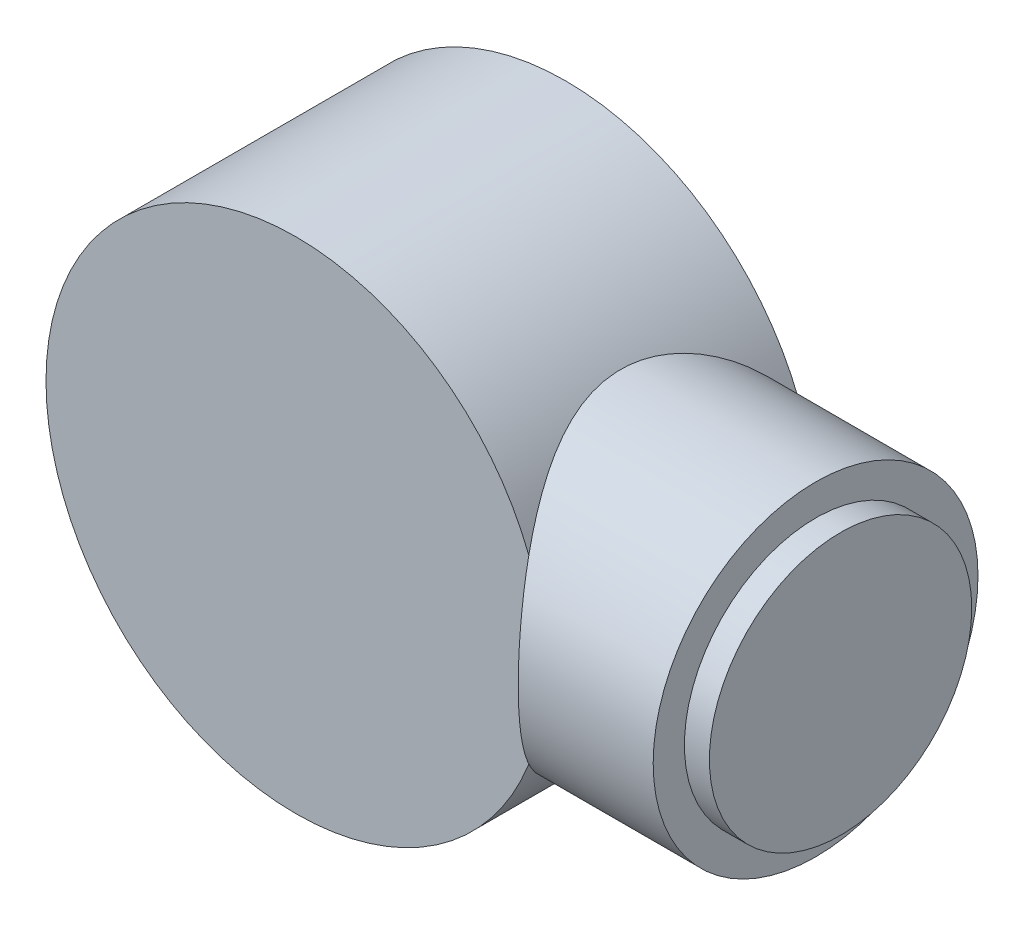
ISO-10303-21;
HEADER;
FILE_DESCRIPTION(('STEP AP214'),'2;1');
FILE_NAME('part.step','',(''),(''),'','','');
FILE_SCHEMA(('AUTOMOTIVE_DESIGN { 1 0 10303 214 1 1 1 1 }'));
ENDSEC;
DATA;
#1=APPLICATION_CONTEXT('core data for automotive mechanical design processes');
#2=APPLICATION_PROTOCOL_DEFINITION('international standard','automotive_design',2000,#1);
#3=PRODUCT_CONTEXT('',#1,'mechanical');
#4=PRODUCT('Part','Part','',(#3));
#5=PRODUCT_RELATED_PRODUCT_CATEGORY('part','',(#4));
#6=PRODUCT_DEFINITION_FORMATION('','',#4);
#7=PRODUCT_DEFINITION_CONTEXT('part definition',#1,'design');
#8=PRODUCT_DEFINITION('design','',#6,#7);
#9=PRODUCT_DEFINITION_SHAPE('','',#8);
#10=(LENGTH_UNIT() NAMED_UNIT(*) SI_UNIT(.MILLI.,.METRE.));
#11=(NAMED_UNIT(*) PLANE_ANGLE_UNIT() SI_UNIT($,.RADIAN.));
#12=(NAMED_UNIT(*) SI_UNIT($,.STERADIAN.) SOLID_ANGLE_UNIT());
#13=UNCERTAINTY_MEASURE_WITH_UNIT(LENGTH_MEASURE(1.E-05),#10,'distance_accuracy_value','');
#14=(GEOMETRIC_REPRESENTATION_CONTEXT(3) GLOBAL_UNCERTAINTY_ASSIGNED_CONTEXT((#13)) GLOBAL_UNIT_ASSIGNED_CONTEXT((#10,
#11,#12)) REPRESENTATION_CONTEXT('',''));
#15=CARTESIAN_POINT('',(0.,0.,0.));
#16=DIRECTION('',(0.,0.,1.));
#17=DIRECTION('',(1.,0.,0.));
#18=AXIS2_PLACEMENT_3D('',#15,#16,#17);
#19=CARTESIAN_POINT('',(77.,0.,0.));
#20=DIRECTION('',(1.,0.,0.));
#21=DIRECTION('',(0.,0.,-1.));
#22=AXIS2_PLACEMENT_3D('',#19,#20,#21);
#23=PLANE('',#22);
#24=CARTESIAN_POINT('',(77.,0.,27.));
#25=DIRECTION('',(1.,0.,0.));
#26=DIRECTION('',(0.,0.,-1.));
#27=AXIS2_PLACEMENT_3D('',#24,#25,#26);
#28=CIRCLE('',#27,26.25);
#29=CARTESIAN_POINT('',(77.,0.,0.750000000000001));
#30=VERTEX_POINT('',#29);
#31=EDGE_CURVE('E11',#30,#30,#28,.T.);
#32=ORIENTED_EDGE('',*,*,#31,.F.);
#33=EDGE_LOOP('',(#32));
#34=FACE_BOUND('',#33,.T.);
#35=CARTESIAN_POINT('',(77.,0.,27.));
#36=DIRECTION('',(1.,0.,0.));
#37=DIRECTION('',(0.,0.,-1.));
#38=AXIS2_PLACEMENT_3D('',#35,#36,#37);
#39=CIRCLE('',#38,32.5);
#40=CARTESIAN_POINT('',(77.,0.,-5.5));
#41=VERTEX_POINT('',#40);
#42=EDGE_CURVE('E63',#41,#41,#39,.T.);
#43=ORIENTED_EDGE('',*,*,#42,.T.);
#44=EDGE_LOOP('',(#43));
#45=FACE_BOUND('',#44,.T.);
#46=ADVANCED_FACE('F47',(#34,#45),#23,.T.);
#47=CARTESIAN_POINT('',(-50.001,0.,27.));
#48=DIRECTION('',(1.,0.,0.));
#49=DIRECTION('',(0.,0.,-1.));
#50=AXIS2_PLACEMENT_3D('',#47,#48,#49);
#51=CYLINDRICAL_SURFACE('',#50,32.5);
#52=ORIENTED_EDGE('',*,*,#42,.F.);
#53=EDGE_LOOP('',(#52));
#54=FACE_BOUND('',#53,.T.);
#55=CARTESIAN_POINT('',(50.,0.,-5.5));
#56=CARTESIAN_POINT('',(49.9999950832951,0.820379898340808,-5.49999466046045));
#57=CARTESIAN_POINT('',(49.9797625626082,1.64084726886599,-5.46889183519829));
#58=CARTESIAN_POINT('',(49.8993279047576,3.27517627569682,-5.34493934746414));
#59=CARTESIAN_POINT('',(49.8391202522668,4.08903698480234,-5.25208116466715));
#60=CARTESIAN_POINT('',(49.6801748227282,5.70432342494345,-5.00591516436292));
#61=CARTESIAN_POINT('',(49.5814093942654,6.50573980179267,-4.85256396392356));
#62=CARTESIAN_POINT('',(49.3477186738602,8.08972592140923,-4.48756849820513));
#63=CARTESIAN_POINT('',(49.212794126871,8.87229605208658,-4.2759254338575));
#64=CARTESIAN_POINT('',(48.9105837019917,10.409890979968,-3.79820184570894));
#65=CARTESIAN_POINT('',(48.7434562311797,11.1650299429453,-3.53238743761594));
#66=CARTESIAN_POINT('',(48.3799715633452,12.6475670057983,-2.94868585443072));
#67=CARTESIAN_POINT('',(48.1836142984633,13.3749650412661,-2.63079855844675));
#68=CARTESIAN_POINT('',(47.7655753618638,14.7986574365594,-1.9460483734245));
#69=CARTESIAN_POINT('',(47.5438947789436,15.4949531318671,-1.57918758992853));
#70=CARTESIAN_POINT('',(47.0793256843562,16.853866771853,-0.799477265192811));
#71=CARTESIAN_POINT('',(46.8364361825179,17.5164831418727,-0.38662557654837));
#72=CARTESIAN_POINT('',(46.31288226742,18.8594396012604,0.518300920156271));
#73=CARTESIAN_POINT('',(46.030755539401,19.5366956160193,1.01410599191766));
#74=CARTESIAN_POINT('',(45.4522443941303,20.8472210237898,2.05320041309447));
#75=CARTESIAN_POINT('',(45.1558593389838,21.4804884457185,2.59649188786588));
#76=CARTESIAN_POINT('',(44.5542181709047,22.7021098692218,3.72858800385993));
#77=CARTESIAN_POINT('',(44.2489510586984,23.2904045982318,4.31745071869159));
#78=CARTESIAN_POINT('',(43.635955205152,24.4195865043336,5.53782423965643));
#79=CARTESIAN_POINT('',(43.3282263201168,24.9604708916954,6.16933755157977));
#80=CARTESIAN_POINT('',(42.6711530158535,26.0700560672088,7.57025191176403));
#81=CARTESIAN_POINT('',(42.3224327873107,26.6309119255251,8.34618501317327));
#82=CARTESIAN_POINT('',(41.6406131212886,27.6848953678642,9.94957044777783));
#83=CARTESIAN_POINT('',(41.3075169872343,28.1780086711108,10.7770335907289));
#84=CARTESIAN_POINT('',(40.669017868988,29.0919462219696,12.4796375672601));
#85=CARTESIAN_POINT('',(40.3635774153682,29.5128689906529,13.3547112402174));
#86=CARTESIAN_POINT('',(39.7925815815168,30.2783525612671,15.1499984864518));
#87=CARTESIAN_POINT('',(39.5270080979029,30.6229480570224,16.0701913179829));
#88=CARTESIAN_POINT('',(39.1151707569848,31.1461312138078,17.6898576211882));
#89=CARTESIAN_POINT('',(38.9562369559204,31.3442611136038,18.3798478972654));
#90=CARTESIAN_POINT('',(38.6709512544293,31.695564794545,19.7777927595638));
#91=CARTESIAN_POINT('',(38.5445940631359,31.848745876524,20.4857444080825));
#92=CARTESIAN_POINT('',(38.328980642896,32.1079075043085,21.9148379579285));
#93=CARTESIAN_POINT('',(38.2396737765112,32.213952486247,22.6359604408029));
#94=CARTESIAN_POINT('',(38.1013167187525,32.3774801531489,24.0875823449805));
#95=CARTESIAN_POINT('',(38.0522668939434,32.4349623959195,24.8180818516057));
#96=CARTESIAN_POINT('',(37.9963316864904,32.5004721086949,26.2854803451552));
#97=CARTESIAN_POINT('',(37.9895935697563,32.508326850756,27.0223927537606));
#98=CARTESIAN_POINT('',(38.0189586121582,32.4739783985208,28.4941838153935));
#99=CARTESIAN_POINT('',(38.0550619680412,32.4317749743356,29.2290624590657));
#100=CARTESIAN_POINT('',(38.168648429343,32.298017031725,30.691581698894));
#101=CARTESIAN_POINT('',(38.2461617042717,32.2064265315171,31.4192166233723));
#102=CARTESIAN_POINT('',(38.43953216099,31.9753805209268,32.8616220334858));
#103=CARTESIAN_POINT('',(38.5553901243586,31.8359240348907,33.5763922565868));
#104=CARTESIAN_POINT('',(38.8165742872301,31.5168911106297,34.9639466936341));
#105=CARTESIAN_POINT('',(38.9607173353993,31.33890276179,35.6373226704315));
#106=CARTESIAN_POINT('',(39.2765368375223,30.9421702821062,36.9655787328999));
#107=CARTESIAN_POINT('',(39.4482240312041,30.7234102485866,37.6204514863652));
#108=CARTESIAN_POINT('',(39.8145826406525,30.247135742793,38.9093625725826));
#109=CARTESIAN_POINT('',(40.0092566397756,29.9896169137431,39.5433985533529));
#110=CARTESIAN_POINT('',(40.4170288058455,29.4377556466839,40.7888514561042));
#111=CARTESIAN_POINT('',(40.6301227285746,29.1434216844657,41.4002735425394));
#112=CARTESIAN_POINT('',(41.1140079381856,28.457817543033,42.7180777586586));
#113=CARTESIAN_POINT('',(41.3878797638847,28.0588852943435,43.4193502974399));
#114=CARTESIAN_POINT('',(41.949038749162,27.2127893027469,44.7865262043896));
#115=CARTESIAN_POINT('',(42.2363271724089,26.7656210114159,45.452426228251));
#116=CARTESIAN_POINT('',(42.8182561243996,25.8244717865271,46.7481253404724));
#117=CARTESIAN_POINT('',(43.1129043018876,25.330440520131,47.3778844200849));
#118=CARTESIAN_POINT('',(43.7033294929278,24.2975913742116,48.5989955295088));
#119=CARTESIAN_POINT('',(43.9991065762731,23.7587706814012,49.1903451426055));
#120=CARTESIAN_POINT('',(44.6433757161103,22.5286511323823,50.4440586838091));
#121=CARTESIAN_POINT('',(44.9909276528173,21.8280825337455,51.0978541444607));
#122=CARTESIAN_POINT('',(45.6707389230497,20.3674410882344,52.3444130595286));
#123=CARTESIAN_POINT('',(46.0029955959866,19.6073579505351,52.9371659176914));
#124=CARTESIAN_POINT('',(46.6432717696123,18.0313075910058,54.0565210365045));
#125=CARTESIAN_POINT('',(46.9513108856265,17.2153866190105,54.5831770437384));
#126=CARTESIAN_POINT('',(47.5350545534779,15.531013891883,55.5654939457799));
#127=CARTESIAN_POINT('',(47.8107680817938,14.6625768219423,56.0211745613144));
#128=CARTESIAN_POINT('',(48.2712989219017,13.0551073362084,56.773110475653));
#129=CARTESIAN_POINT('',(48.4633033177363,12.324514168495,57.0830659962705));
#130=CARTESIAN_POINT('',(48.8176192333411,10.8362739804481,57.6505975880767));
#131=CARTESIAN_POINT('',(48.979934361987,10.0786302616407,57.9081800258954));
#132=CARTESIAN_POINT('',(49.2713253417834,8.54098217221501,58.3678991154421));
#133=CARTESIAN_POINT('',(49.4004230450817,7.76099287899599,58.5700722240386));
#134=CARTESIAN_POINT('',(49.6226053964351,6.18317573262193,58.9166205684597));
#135=CARTESIAN_POINT('',(49.7156894160999,5.38534756845951,59.0609947957731));
#136=CARTESIAN_POINT('',(49.8639036202448,3.77460108589335,59.2903482323196));
#137=CARTESIAN_POINT('',(49.9188902972156,2.9616374291221,59.3751028808245));
#138=CARTESIAN_POINT('',(49.9889806039512,1.32990448445416,59.4830706056691));
#139=CARTESIAN_POINT('',(50.0040842099017,0.511135193091196,59.506283645262));
#140=CARTESIAN_POINT('',(49.9940280170243,-1.12558702772942,59.4908120509778));
#141=CARTESIAN_POINT('',(49.9688671194818,-1.9435399343006,59.4521257280265));
#142=CARTESIAN_POINT('',(49.8789112577068,-3.57199749573233,59.3134426463783));
#143=CARTESIAN_POINT('',(49.8141175484482,-4.38250238560966,59.2134478290158));
#144=CARTESIAN_POINT('',(49.6514918470381,-5.94197489256988,58.9613719584213));
#145=CARTESIAN_POINT('',(49.555854505623,-6.6917350268788,58.8127432372991));
#146=CARTESIAN_POINT('',(49.3329577485776,-8.1744282627694,58.4644026294863));
#147=CARTESIAN_POINT('',(49.2056998557011,-8.907362172797,58.2646932026805));
#148=CARTESIAN_POINT('',(48.9220905433369,-10.3523561917551,57.8164089830273));
#149=CARTESIAN_POINT('',(48.7657373107556,-11.0644149966383,57.5678311448613));
#150=CARTESIAN_POINT('',(48.4268841832775,-12.4641703227049,57.0242943573914));
#151=CARTESIAN_POINT('',(48.2443828654948,-13.1518655155656,56.7293328839699));
#152=CARTESIAN_POINT('',(47.8429790386047,-14.5468935746808,56.0735703190451));
#153=CARTESIAN_POINT('',(47.6224282140744,-15.2522697974981,55.7096182026578));
#154=CARTESIAN_POINT('',(47.1593126222709,-16.629097865148,54.9346965691568));
#155=CARTESIAN_POINT('',(46.9167470587903,-17.3005484816245,54.5237253513626));
#156=CARTESIAN_POINT('',(46.4138194489232,-18.607742420822,53.6574027719117));
#157=CARTESIAN_POINT('',(46.1534470794155,-19.2434646350104,53.2020256005709));
#158=CARTESIAN_POINT('',(45.619526143917,-20.4770764710835,52.2496858797039));
#159=CARTESIAN_POINT('',(45.3459768617906,-21.074964032645,51.7527210688985));
#160=CARTESIAN_POINT('',(44.7471563176791,-22.3213173683831,50.6391921817521));
#161=CARTESIAN_POINT('',(44.4204496488134,-22.9632199419752,50.0160396905248));
#162=CARTESIAN_POINT('',(43.7630045869561,-24.1926746957852,48.7200933671887));
#163=CARTESIAN_POINT('',(43.4322656332202,-24.7802192169113,48.047292563529));
#164=CARTESIAN_POINT('',(42.7745161992376,-25.8990740511106,46.6541722015348));
#165=CARTESIAN_POINT('',(42.4475074152823,-26.4303596241356,45.9338319617479));
#166=CARTESIAN_POINT('',(41.8059041408205,-27.4339387672869,44.4479953540767));
#167=CARTESIAN_POINT('',(41.4913079318813,-27.906240523045,43.6825052737353));
#168=CARTESIAN_POINT('',(40.9200564815249,-28.7362441351099,42.2022955754751));
#169=CARTESIAN_POINT('',(40.6609659921665,-29.1008956870287,41.4924109597111));
#170=CARTESIAN_POINT('',(40.1664965087985,-29.779672463042,40.0408179524925));
#171=CARTESIAN_POINT('',(39.9311170218804,-30.0937987375458,39.2991102230396));
#172=CARTESIAN_POINT('',(39.4917120575915,-30.6681484086005,37.7873745813625));
#173=CARTESIAN_POINT('',(39.287640214774,-30.9284517177363,37.0173906827655));
#174=CARTESIAN_POINT('',(38.9178700773443,-31.3924770297742,35.4515519018164));
#175=CARTESIAN_POINT('',(38.7521647978538,-31.5962093331374,34.6557017587133));
#176=CARTESIAN_POINT('',(38.487621867937,-31.9176987315613,33.1645325250141));
#177=CARTESIAN_POINT('',(38.3824721686329,-32.0437830280959,32.4721239485102));
#178=CARTESIAN_POINT('',(38.2084463267924,-32.2510939378217,31.0761112799988));
#179=CARTESIAN_POINT('',(38.139566259711,-32.3323254043466,30.3725084077581));
#180=CARTESIAN_POINT('',(38.0406628594831,-32.4486339223221,28.95921823179));
#181=CARTESIAN_POINT('',(38.0106142233053,-32.4837410292135,28.2495351938049));
#182=CARTESIAN_POINT('',(37.9904569091207,-32.5073136396741,26.8288028909469));
#183=CARTESIAN_POINT('',(38.0003490888071,-32.495778141635,26.1177535970627));
#184=CARTESIAN_POINT('',(38.059663883183,-32.4262861105484,24.700175772028));
#185=CARTESIAN_POINT('',(38.1090550774856,-32.368366474764,23.9936440973489));
#186=CARTESIAN_POINT('',(38.2454441231086,-32.2070967599132,22.5895137156665));
#187=CARTESIAN_POINT('',(38.3324416199641,-32.1037471090554,21.8919149245286));
#188=CARTESIAN_POINT('',(38.5410535221566,-31.8530019051811,20.509194774244));
#189=CARTESIAN_POINT('',(38.662705517609,-31.7055585145022,19.824087828478));
#190=CARTESIAN_POINT('',(38.9366337080108,-31.3685451393114,18.4705803278069));
#191=CARTESIAN_POINT('',(39.0889139006484,-31.1789696552474,17.8021819665759));
#192=CARTESIAN_POINT('',(39.4681515862117,-30.6982762499881,16.291855828066));
#193=CARTESIAN_POINT('',(39.7039201757252,-30.3936788069919,15.4564089668611));
#194=CARTESIAN_POINT('',(40.2095373547831,-29.721538113857,13.821926549327));
#195=CARTESIAN_POINT('',(40.4793956364613,-29.3539769517075,13.0229014364316));
#196=CARTESIAN_POINT('',(41.0440210917243,-28.5591694410698,11.4632462946186));
#197=CARTESIAN_POINT('',(41.3388144790771,-28.1318599644147,10.7026580493571));
#198=CARTESIAN_POINT('',(41.9442700701395,-27.2208981243104,9.22283282769884));
#199=CARTESIAN_POINT('',(42.2549313196396,-26.7372491465867,8.50359337032016));
#200=CARTESIAN_POINT('',(42.8889875449583,-25.7080858845502,7.09735699713856));
#201=CARTESIAN_POINT('',(43.2125052568565,-25.1617288893835,6.41103263250462));
#202=CARTESIAN_POINT('',(43.8598896717567,-24.0154817005351,5.0848268798128));
#203=CARTESIAN_POINT('',(44.1837563765708,-23.4155912275827,4.4449457340691));
#204=CARTESIAN_POINT('',(44.8246827044135,-22.1639850361142,3.2139037879028));
#205=CARTESIAN_POINT('',(45.1417405445902,-21.5122559491886,2.62275563555921));
#206=CARTESIAN_POINT('',(45.7620737335855,-20.1590357237669,1.49234233674686));
#207=CARTESIAN_POINT('',(46.0653483829597,-19.4575420645242,0.953079821728656));
#208=CARTESIAN_POINT('',(46.6810020521624,-17.9339091298916,-0.121560308825123));
#209=CARTESIAN_POINT('',(46.991220745991,-17.1067350387869,-0.651074470906869));
#210=CARTESIAN_POINT('',(47.5783138826708,-15.3986971256461,-1.63744016453904));
#211=CARTESIAN_POINT('',(47.855183285751,-14.5178252189714,-2.09428071693315));
#212=CARTESIAN_POINT('',(48.3668793423392,-12.7092691977611,-2.92847198378674));
#213=CARTESIAN_POINT('',(48.6017836772997,-11.7816757386604,-3.30596980304276));
#214=CARTESIAN_POINT('',(48.917289614073,-10.3602514667507,-3.80857072157964));
#215=CARTESIAN_POINT('',(49.016307598532,-9.88149221910737,-3.96548291174638));
#216=CARTESIAN_POINT('',(49.2013116274098,-8.91476468347579,-4.25750903195082));
#217=CARTESIAN_POINT('',(49.2872955229403,-8.42679489185499,-4.39261936782316));
#218=CARTESIAN_POINT('',(49.4696847366718,-7.29205135260537,-4.67830917492835));
#219=CARTESIAN_POINT('',(49.561201378512,-6.6424628353478,-4.82092889076201));
#220=CARTESIAN_POINT('',(49.7191592253278,-5.33292853081827,-5.06639380811066));
#221=CARTESIAN_POINT('',(49.7856047759838,-4.67298455917691,-5.1692459027954));
#222=CARTESIAN_POINT('',(49.8923502038399,-3.34607343613181,-5.33420136120816));
#223=CARTESIAN_POINT('',(49.9326568726316,-2.67910815486154,-5.39631530986083));
#224=CARTESIAN_POINT('',(49.9864860599114,-1.3414484839905,-5.47922032849765));
#225=CARTESIAN_POINT('',(50.0000040199631,-0.670753479198282,-5.50000436567832));
#226=CARTESIAN_POINT('',(50.,0.,-5.5));
#227=B_SPLINE_CURVE_WITH_KNOTS('',3,(#55,#56,#57,#58,#59,#60,#61,#62,#63,#64,#65,#66,#67,#68,
#69,#70,#71,#72,#73,#74,#75,#76,#77,#78,#79,#80,#81,#82,#83,#84,#85,#86,#87,#88,#89,#90,#91,#92,
#93,#94,#95,#96,#97,#98,#99,#100,#101,#102,#103,#104,#105,#106,#107,#108,#109,#110,#111,#112,
#113,#114,#115,#116,#117,#118,#119,#120,#121,#122,#123,#124,#125,#126,#127,#128,#129,#130,#131,
#132,#133,#134,#135,#136,#137,#138,#139,#140,#141,#142,#143,#144,#145,#146,#147,#148,#149,#150,
#151,#152,#153,#154,#155,#156,#157,#158,#159,#160,#161,#162,#163,#164,#165,#166,#167,#168,#169,
#170,#171,#172,#173,#174,#175,#176,#177,#178,#179,#180,#181,#182,#183,#184,#185,#186,#187,#188,
#189,#190,#191,#192,#193,#194,#195,#196,#197,#198,#199,#200,#201,#202,#203,#204,#205,#206,#207,
#208,#209,#210,#211,#212,#213,#214,#215,#216,#217,#218,#219,#220,#221,#222,#223,#224,#225,#226),
.UNSPECIFIED.,.T.,.F.,(4,2,2,2,2,2,2,2,2,2,2,2,2,2,2,2,2,2,2,2,2,2,2,2,2,2,2,2,2,2,2,2,2,2,2,2,
2,2,2,2,2,2,2,2,2,2,2,2,2,2,2,2,2,2,2,2,2,2,2,2,2,2,2,2,2,2,2,2,2,2,2,2,2,2,2,2,2,2,2,2,2,2,2,2,
2,4),(0.,2.46045993003765,4.92125939771797,7.38382686034164,9.84634359284154,12.2970428769451,
14.7477478506417,17.1983474938338,19.6490616082808,22.3029292718831,24.9569157759163,
27.6143419106252,30.2719243093767,33.3251156223354,36.3789495926578,39.4285821341122,
42.4768256369194,44.6805266408034,46.8838695090903,49.0841910232989,51.2845325725393,
53.4925281856819,55.7005339389497,57.9101505497284,60.1198122018549,62.2515577277178,
64.3841364708946,66.5169551110068,68.6492836220793,71.2029639599345,73.7568853082476,
76.3135814239511,78.8704382508673,81.9247620382729,84.9796151285971,88.031967848395,
91.0834709439921,93.5305607781958,95.9773529586959,98.4225313729449,100.867752450345,
103.322134985925,105.776518987026,108.230969963086,110.685343222929,112.993712174889,
115.301969984042,117.61037168185,119.918899042404,122.38786060554,124.85691149924,
127.327406109676,129.798035137756,132.652317947386,135.507002317129,138.362936875042,
141.218474651779,143.733409825373,146.248292707263,148.759414421274,151.270078609418,
153.402630947015,155.534952484961,157.665883874566,159.796861024257,161.926144723967,
164.055408354167,166.186990472554,168.318850992474,171.074796064786,173.83152645837,
176.591191849729,179.35069148432,182.152963084706,184.955249304694,187.758260550462,
190.5614138799,193.646940868185,196.73293356028,199.813153211307,201.352923022289,
202.892946414719,204.905180739947,206.91706611552,208.928428538954,210.940133191687),.UNSPECIFIED.);
#228=CARTESIAN_POINT('',(50.,0.,-5.5));
#229=VERTEX_POINT('',#228);
#230=EDGE_CURVE('E52',#229,#229,#227,.T.);
#231=ORIENTED_EDGE('',*,*,#230,.T.);
#232=EDGE_LOOP('',(#231));
#233=FACE_BOUND('',#232,.T.);
#234=ADVANCED_FACE('F49',(#54,#233),#51,.T.);
#235=CARTESIAN_POINT('',(0.,0.,54.));
#236=DIRECTION('',(0.,0.,-1.));
#237=DIRECTION('',(-1.,0.,0.));
#238=AXIS2_PLACEMENT_3D('',#235,#236,#237);
#239=CYLINDRICAL_SURFACE('',#238,50.);
#240=ORIENTED_EDGE('',*,*,#230,.F.);
#241=EDGE_LOOP('',(#240));
#242=FACE_BOUND('',#241,.T.);
#243=ADVANCED_FACE('F76',(#242),#239,.F.);
#244=CARTESIAN_POINT('',(82.,0.,27.));
#245=DIRECTION('',(-1.,0.,0.));
#246=DIRECTION('',(0.,0.,1.));
#247=AXIS2_PLACEMENT_3D('',#244,#245,#246);
#248=CYLINDRICAL_SURFACE('',#247,26.25);
#249=CARTESIAN_POINT('',(82.,0.,27.));
#250=DIRECTION('',(1.,0.,0.));
#251=DIRECTION('',(0.,0.,-1.));
#252=AXIS2_PLACEMENT_3D('',#249,#250,#251);
#253=CIRCLE('',#252,26.25);
#254=CARTESIAN_POINT('',(82.,0.,0.750000000000001));
#255=VERTEX_POINT('',#254);
#256=EDGE_CURVE('E65',#255,#255,#253,.T.);
#257=ORIENTED_EDGE('',*,*,#256,.F.);
#258=EDGE_LOOP('',(#257));
#259=FACE_BOUND('',#258,.T.);
#260=ORIENTED_EDGE('',*,*,#31,.T.);
#261=EDGE_LOOP('',(#260));
#262=FACE_BOUND('',#261,.T.);
#263=ADVANCED_FACE('F74',(#259,#262),#248,.T.);
#264=CARTESIAN_POINT('',(82.,0.,27.));
#265=DIRECTION('',(1.,0.,0.));
#266=DIRECTION('',(0.,0.,-1.));
#267=AXIS2_PLACEMENT_3D('',#264,#265,#266);
#268=PLANE('',#267);
#269=ORIENTED_EDGE('',*,*,#256,.T.);
#270=EDGE_LOOP('',(#269));
#271=FACE_BOUND('',#270,.T.);
#272=ADVANCED_FACE('F72',(#271),#268,.T.);
#273=CLOSED_SHELL('',(#46,#234,#243,#263,#272));
#274=MANIFOLD_SOLID_BREP('B2',#273);
#275=CARTESIAN_POINT('',(0.,0.,54.));
#276=DIRECTION('',(0.,0.,-1.));
#277=DIRECTION('',(-1.,0.,0.));
#278=AXIS2_PLACEMENT_3D('',#275,#276,#277);
#279=CYLINDRICAL_SURFACE('',#278,50.);
#280=CARTESIAN_POINT('',(0.,0.,54.));
#281=DIRECTION('',(0.,0.,1.));
#282=DIRECTION('',(1.,0.,0.));
#283=AXIS2_PLACEMENT_3D('',#280,#281,#282);
#284=CIRCLE('',#283,50.);
#285=CARTESIAN_POINT('',(50.,0.,54.));
#286=VERTEX_POINT('',#285);
#287=EDGE_CURVE('E46',#286,#286,#284,.T.);
#288=ORIENTED_EDGE('',*,*,#287,.F.);
#289=EDGE_LOOP('',(#288));
#290=FACE_BOUND('',#289,.T.);
#291=CARTESIAN_POINT('',(0.,0.,0.));
#292=DIRECTION('',(0.,0.,1.));
#293=DIRECTION('',(1.,0.,0.));
#294=AXIS2_PLACEMENT_3D('',#291,#292,#293);
#295=CIRCLE('',#294,50.);
#296=CARTESIAN_POINT('',(50.,0.,0.));
#297=VERTEX_POINT('',#296);
#298=EDGE_CURVE('E126',#297,#297,#295,.T.);
#299=ORIENTED_EDGE('',*,*,#298,.T.);
#300=EDGE_LOOP('',(#299));
#301=FACE_BOUND('',#300,.T.);
#302=ADVANCED_FACE('F123',(#290,#301),#279,.T.);
#303=CARTESIAN_POINT('',(0.,0.,54.));
#304=DIRECTION('',(0.,0.,1.));
#305=DIRECTION('',(1.,0.,0.));
#306=AXIS2_PLACEMENT_3D('',#303,#304,#305);
#307=PLANE('',#306);
#308=ORIENTED_EDGE('',*,*,#287,.T.);
#309=EDGE_LOOP('',(#308));
#310=FACE_BOUND('',#309,.T.);
#311=ADVANCED_FACE('F140',(#310),#307,.T.);
#312=CARTESIAN_POINT('',(0.,0.,0.));
#313=DIRECTION('',(0.,0.,1.));
#314=DIRECTION('',(1.,0.,0.));
#315=AXIS2_PLACEMENT_3D('',#312,#313,#314);
#316=PLANE('',#315);
#317=ORIENTED_EDGE('',*,*,#298,.F.);
#318=EDGE_LOOP('',(#317));
#319=FACE_BOUND('',#318,.T.);
#320=ADVANCED_FACE('F138',(#319),#316,.F.);
#321=CLOSED_SHELL('',(#302,#311,#320));
#322=MANIFOLD_SOLID_BREP('B6',#321);
#323=ADVANCED_BREP_SHAPE_REPRESENTATION('',(#18,#274,#322),#14);
#324=SHAPE_DEFINITION_REPRESENTATION(#9,#323);
ENDSEC;
END-ISO-10303-21;
